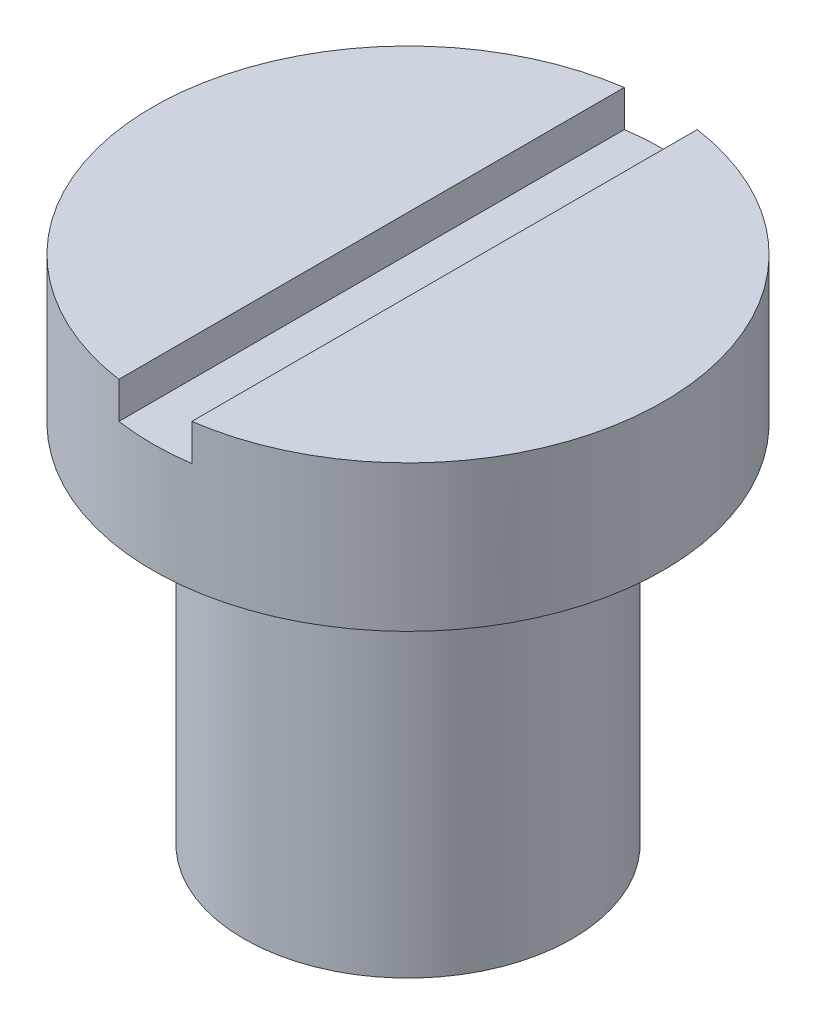
ISO-10303-21;
HEADER;
FILE_DESCRIPTION(('STEP AP214'),'2;1');
FILE_NAME('part.step','',(''),(''),'','','');
FILE_SCHEMA(('AUTOMOTIVE_DESIGN { 1 0 10303 214 1 1 1 1 }'));
ENDSEC;
DATA;
#1=APPLICATION_CONTEXT('core data for automotive mechanical design processes');
#2=APPLICATION_PROTOCOL_DEFINITION('international standard','automotive_design',2000,#1);
#3=PRODUCT_CONTEXT('',#1,'mechanical');
#4=PRODUCT('Part','Part','',(#3));
#5=PRODUCT_RELATED_PRODUCT_CATEGORY('part','',(#4));
#6=PRODUCT_DEFINITION_FORMATION('','',#4);
#7=PRODUCT_DEFINITION_CONTEXT('part definition',#1,'design');
#8=PRODUCT_DEFINITION('design','',#6,#7);
#9=PRODUCT_DEFINITION_SHAPE('','',#8);
#10=(LENGTH_UNIT() NAMED_UNIT(*) SI_UNIT(.MILLI.,.METRE.));
#11=(NAMED_UNIT(*) PLANE_ANGLE_UNIT() SI_UNIT($,.RADIAN.));
#12=(NAMED_UNIT(*) SI_UNIT($,.STERADIAN.) SOLID_ANGLE_UNIT());
#13=UNCERTAINTY_MEASURE_WITH_UNIT(LENGTH_MEASURE(1.E-05),#10,'distance_accuracy_value','');
#14=(GEOMETRIC_REPRESENTATION_CONTEXT(3) GLOBAL_UNCERTAINTY_ASSIGNED_CONTEXT((#13)) GLOBAL_UNIT_ASSIGNED_CONTEXT((#10,
#11,#12)) REPRESENTATION_CONTEXT('',''));
#15=CARTESIAN_POINT('',(0.,0.,0.));
#16=DIRECTION('',(0.,0.,1.));
#17=DIRECTION('',(1.,0.,0.));
#18=AXIS2_PLACEMENT_3D('',#15,#16,#17);
#19=CARTESIAN_POINT('',(0.,14.,0.));
#20=DIRECTION('',(0.,1.,0.));
#21=DIRECTION('',(0.,0.,1.));
#22=AXIS2_PLACEMENT_3D('',#19,#20,#21);
#23=PLANE('',#22);
#24=DIRECTION('',(0.,0.,-1.));
#25=VECTOR('',#24,1.);
#26=CARTESIAN_POINT('',(1.,14.,0.));
#27=LINE('',#26,#25);
#28=CARTESIAN_POINT('',(1.,14.,6.92820323027551));
#29=VERTEX_POINT('',#28);
#30=CARTESIAN_POINT('',(1.,14.,-6.92820323027551));
#31=VERTEX_POINT('',#30);
#32=EDGE_CURVE('E110',#29,#31,#27,.T.);
#33=ORIENTED_EDGE('',*,*,#32,.F.);
#34=CARTESIAN_POINT('',(0.,14.,0.));
#35=DIRECTION('',(0.,-1.,0.));
#36=DIRECTION('',(0.,0.,-1.));
#37=AXIS2_PLACEMENT_3D('',#34,#35,#36);
#38=CIRCLE('',#37,7.);
#39=EDGE_CURVE('E98',#31,#29,#38,.T.);
#40=ORIENTED_EDGE('',*,*,#39,.F.);
#41=EDGE_LOOP('',(#33,#40));
#42=FACE_BOUND('',#41,.T.);
#43=ADVANCED_FACE('F34',(#42),#23,.T.);
#44=CARTESIAN_POINT('',(4.5,0.,0.));
#45=DIRECTION('',(0.,-1.,0.));
#46=DIRECTION('',(0.,0.,-1.));
#47=AXIS2_PLACEMENT_3D('',#44,#45,#46);
#48=PLANE('',#47);
#49=CARTESIAN_POINT('',(0.,0.,0.));
#50=DIRECTION('',(0.,-1.,0.));
#51=DIRECTION('',(0.,0.,-1.));
#52=AXIS2_PLACEMENT_3D('',#49,#50,#51);
#53=CIRCLE('',#52,4.5);
#54=CARTESIAN_POINT('',(0.,0.,-4.5));
#55=VERTEX_POINT('',#54);
#56=EDGE_CURVE('E107',#55,#55,#53,.T.);
#57=ORIENTED_EDGE('',*,*,#56,.T.);
#58=EDGE_LOOP('',(#57));
#59=FACE_BOUND('',#58,.T.);
#60=ADVANCED_FACE('F36',(#59),#48,.T.);
#61=DIRECTION('',(0.,0.,1.));
#62=VECTOR('',#61,1.);
#63=CARTESIAN_POINT('',(-1.,14.,0.));
#64=LINE('',#63,#62);
#65=CARTESIAN_POINT('',(-1.,14.,-6.92820323027551));
#66=VERTEX_POINT('',#65);
#67=CARTESIAN_POINT('',(-1.,14.,6.92820323027551));
#68=VERTEX_POINT('',#67);
#69=EDGE_CURVE('E49',#66,#68,#64,.T.);
#70=ORIENTED_EDGE('',*,*,#69,.F.);
#71=EDGE_CURVE('E94',#68,#66,#38,.T.);
#72=ORIENTED_EDGE('',*,*,#71,.F.);
#73=EDGE_LOOP('',(#70,#72));
#74=FACE_BOUND('',#73,.T.);
#75=ADVANCED_FACE('F117',(#74),#23,.T.);
#76=CARTESIAN_POINT('',(0.,0.,0.));
#77=DIRECTION('',(0.,-1.,0.));
#78=DIRECTION('',(0.,0.,-1.));
#79=AXIS2_PLACEMENT_3D('',#76,#77,#78);
#80=CYLINDRICAL_SURFACE('',#79,7.);
#81=DIRECTION('',(0.,-1.,0.));
#82=VECTOR('',#81,1.);
#83=CARTESIAN_POINT('',(1.,0.,-6.92820323027551));
#84=LINE('',#83,#82);
#85=CARTESIAN_POINT('',(1.,13.,-6.92820323027551));
#86=VERTEX_POINT('',#85);
#87=EDGE_CURVE('E11',#31,#86,#84,.T.);
#88=ORIENTED_EDGE('',*,*,#87,.F.);
#89=ORIENTED_EDGE('',*,*,#39,.T.);
#90=DIRECTION('',(0.,-1.,0.));
#91=VECTOR('',#90,1.);
#92=CARTESIAN_POINT('',(1.,0.,6.92820323027551));
#93=LINE('',#92,#91);
#94=CARTESIAN_POINT('',(1.,13.,6.92820323027551));
#95=VERTEX_POINT('',#94);
#96=EDGE_CURVE('E57',#95,#29,#93,.F.);
#97=ORIENTED_EDGE('',*,*,#96,.F.);
#98=CARTESIAN_POINT('',(0.,13.,0.));
#99=DIRECTION('',(0.,-1.,0.));
#100=DIRECTION('',(0.,0.,-1.));
#101=AXIS2_PLACEMENT_3D('',#98,#99,#100);
#102=CIRCLE('',#101,7.);
#103=CARTESIAN_POINT('',(-1.,13.,6.92820323027551));
#104=VERTEX_POINT('',#103);
#105=EDGE_CURVE('E86',#104,#95,#102,.F.);
#106=ORIENTED_EDGE('',*,*,#105,.F.);
#107=DIRECTION('',(0.,-1.,0.));
#108=VECTOR('',#107,1.);
#109=CARTESIAN_POINT('',(-1.,0.,6.92820323027551));
#110=LINE('',#109,#108);
#111=EDGE_CURVE('E88',#68,#104,#110,.T.);
#112=ORIENTED_EDGE('',*,*,#111,.F.);
#113=ORIENTED_EDGE('',*,*,#71,.T.);
#114=DIRECTION('',(0.,-1.,0.));
#115=VECTOR('',#114,1.);
#116=CARTESIAN_POINT('',(-1.,0.,-6.92820323027551));
#117=LINE('',#116,#115);
#118=CARTESIAN_POINT('',(-1.,13.,-6.92820323027551));
#119=VERTEX_POINT('',#118);
#120=EDGE_CURVE('E84',#119,#66,#117,.F.);
#121=ORIENTED_EDGE('',*,*,#120,.F.);
#122=EDGE_CURVE('E42',#86,#119,#102,.F.);
#123=ORIENTED_EDGE('',*,*,#122,.F.);
#124=EDGE_LOOP('',(#88,#89,#97,#106,#112,#113,#121,#123));
#125=FACE_BOUND('',#124,.T.);
#126=CARTESIAN_POINT('',(0.,10.,0.));
#127=DIRECTION('',(0.,-1.,0.));
#128=DIRECTION('',(0.,0.,-1.));
#129=AXIS2_PLACEMENT_3D('',#126,#127,#128);
#130=CIRCLE('',#129,7.);
#131=CARTESIAN_POINT('',(0.,10.,-7.));
#132=VERTEX_POINT('',#131);
#133=EDGE_CURVE('E101',#132,#132,#130,.T.);
#134=ORIENTED_EDGE('',*,*,#133,.F.);
#135=EDGE_LOOP('',(#134));
#136=FACE_BOUND('',#135,.T.);
#137=ADVANCED_FACE('F91',(#125,#136),#80,.T.);
#138=CARTESIAN_POINT('',(7.,10.,0.));
#139=DIRECTION('',(0.,-1.,0.));
#140=DIRECTION('',(0.,0.,-1.));
#141=AXIS2_PLACEMENT_3D('',#138,#139,#140);
#142=PLANE('',#141);
#143=ORIENTED_EDGE('',*,*,#133,.T.);
#144=EDGE_LOOP('',(#143));
#145=FACE_BOUND('',#144,.T.);
#146=CARTESIAN_POINT('',(0.,10.,0.));
#147=DIRECTION('',(0.,-1.,0.));
#148=DIRECTION('',(0.,0.,-1.));
#149=AXIS2_PLACEMENT_3D('',#146,#147,#148);
#150=CIRCLE('',#149,4.5);
#151=CARTESIAN_POINT('',(0.,10.,-4.5));
#152=VERTEX_POINT('',#151);
#153=EDGE_CURVE('E104',#152,#152,#150,.T.);
#154=ORIENTED_EDGE('',*,*,#153,.F.);
#155=EDGE_LOOP('',(#154));
#156=FACE_BOUND('',#155,.T.);
#157=ADVANCED_FACE('F128',(#145,#156),#142,.T.);
#158=CARTESIAN_POINT('',(0.,0.,0.));
#159=DIRECTION('',(0.,-1.,0.));
#160=DIRECTION('',(0.,0.,-1.));
#161=AXIS2_PLACEMENT_3D('',#158,#159,#160);
#162=CYLINDRICAL_SURFACE('',#161,4.5);
#163=ORIENTED_EDGE('',*,*,#153,.T.);
#164=EDGE_LOOP('',(#163));
#165=FACE_BOUND('',#164,.T.);
#166=ORIENTED_EDGE('',*,*,#56,.F.);
#167=EDGE_LOOP('',(#166));
#168=FACE_BOUND('',#167,.T.);
#169=ADVANCED_FACE('F132',(#165,#168),#162,.T.);
#170=CARTESIAN_POINT('',(1.,13.,-10.));
#171=DIRECTION('',(1.,0.,0.));
#172=DIRECTION('',(0.,0.,-1.));
#173=AXIS2_PLACEMENT_3D('',#170,#171,#172);
#174=PLANE('',#173);
#175=ORIENTED_EDGE('',*,*,#96,.T.);
#176=ORIENTED_EDGE('',*,*,#32,.T.);
#177=ORIENTED_EDGE('',*,*,#87,.T.);
#178=DIRECTION('',(0.,0.,1.));
#179=VECTOR('',#178,1.);
#180=CARTESIAN_POINT('',(1.,13.,-10.));
#181=LINE('',#180,#179);
#182=EDGE_CURVE('E80',#86,#95,#181,.T.);
#183=ORIENTED_EDGE('',*,*,#182,.T.);
#184=EDGE_LOOP('',(#175,#176,#177,#183));
#185=FACE_BOUND('',#184,.T.);
#186=ADVANCED_FACE('F113',(#185),#174,.F.);
#187=CARTESIAN_POINT('',(-1.,13.,-10.));
#188=DIRECTION('',(0.,-1.,0.));
#189=DIRECTION('',(0.,0.,-1.));
#190=AXIS2_PLACEMENT_3D('',#187,#188,#189);
#191=PLANE('',#190);
#192=ORIENTED_EDGE('',*,*,#105,.T.);
#193=ORIENTED_EDGE('',*,*,#182,.F.);
#194=ORIENTED_EDGE('',*,*,#122,.T.);
#195=DIRECTION('',(0.,0.,1.));
#196=VECTOR('',#195,1.);
#197=CARTESIAN_POINT('',(-1.,13.,-10.));
#198=LINE('',#197,#196);
#199=EDGE_CURVE('E78',#119,#104,#198,.T.);
#200=ORIENTED_EDGE('',*,*,#199,.T.);
#201=EDGE_LOOP('',(#192,#193,#194,#200));
#202=FACE_BOUND('',#201,.T.);
#203=ADVANCED_FACE('F77',(#202),#191,.F.);
#204=CARTESIAN_POINT('',(-1.,13.,-10.));
#205=DIRECTION('',(-1.,0.,0.));
#206=DIRECTION('',(0.,0.,1.));
#207=AXIS2_PLACEMENT_3D('',#204,#205,#206);
#208=PLANE('',#207);
#209=ORIENTED_EDGE('',*,*,#120,.T.);
#210=ORIENTED_EDGE('',*,*,#69,.T.);
#211=ORIENTED_EDGE('',*,*,#111,.T.);
#212=ORIENTED_EDGE('',*,*,#199,.F.);
#213=EDGE_LOOP('',(#209,#210,#211,#212));
#214=FACE_BOUND('',#213,.T.);
#215=ADVANCED_FACE('F87',(#214),#208,.F.);
#216=CLOSED_SHELL('',(#43,#60,#75,#137,#157,#169,#186,#203,#215));
#217=MANIFOLD_SOLID_BREP('B2',#216);
#218=ADVANCED_BREP_SHAPE_REPRESENTATION('',(#18,#217),#14);
#219=SHAPE_DEFINITION_REPRESENTATION(#9,#218);
ENDSEC;
END-ISO-10303-21;
